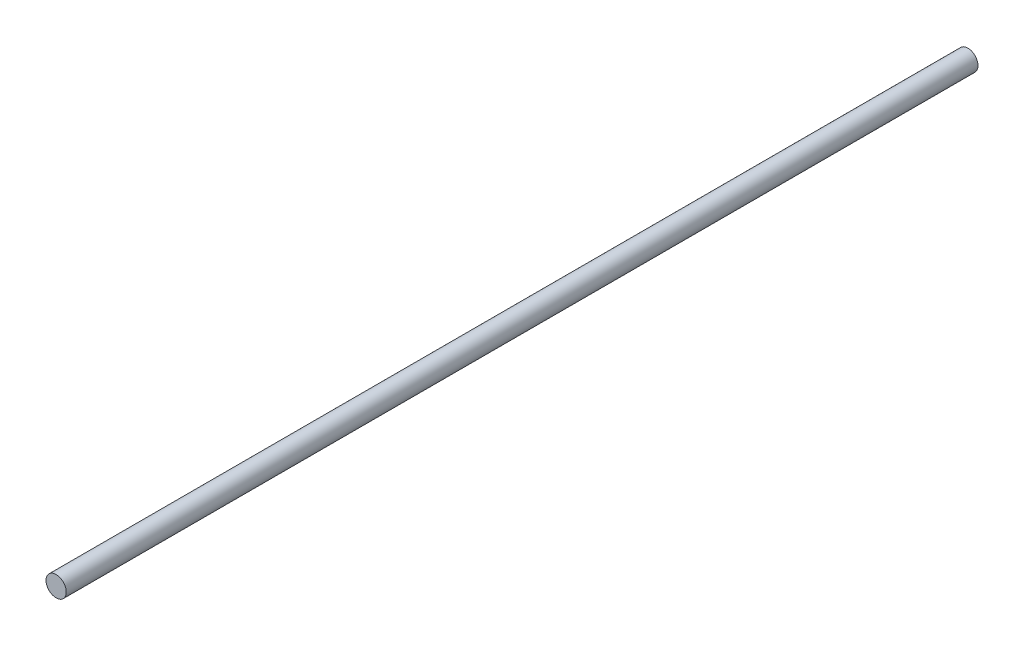
ISO-10303-21;
HEADER;
FILE_DESCRIPTION(('STEP AP214'),'2;1');
FILE_NAME('part.step','',(''),(''),'','','');
FILE_SCHEMA(('AUTOMOTIVE_DESIGN { 1 0 10303 214 1 1 1 1 }'));
ENDSEC;
DATA;
#1=APPLICATION_CONTEXT('core data for automotive mechanical design processes');
#2=APPLICATION_PROTOCOL_DEFINITION('international standard','automotive_design',2000,#1);
#3=PRODUCT_CONTEXT('',#1,'mechanical');
#4=PRODUCT('Part','Part','',(#3));
#5=PRODUCT_RELATED_PRODUCT_CATEGORY('part','',(#4));
#6=PRODUCT_DEFINITION_FORMATION('','',#4);
#7=PRODUCT_DEFINITION_CONTEXT('part definition',#1,'design');
#8=PRODUCT_DEFINITION('design','',#6,#7);
#9=PRODUCT_DEFINITION_SHAPE('','',#8);
#10=(LENGTH_UNIT() NAMED_UNIT(*) SI_UNIT(.MILLI.,.METRE.));
#11=(NAMED_UNIT(*) PLANE_ANGLE_UNIT() SI_UNIT($,.RADIAN.));
#12=(NAMED_UNIT(*) SI_UNIT($,.STERADIAN.) SOLID_ANGLE_UNIT());
#13=UNCERTAINTY_MEASURE_WITH_UNIT(LENGTH_MEASURE(1.E-05),#10,'distance_accuracy_value','');
#14=(GEOMETRIC_REPRESENTATION_CONTEXT(3) GLOBAL_UNCERTAINTY_ASSIGNED_CONTEXT((#13)) GLOBAL_UNIT_ASSIGNED_CONTEXT((#10,
#11,#12)) REPRESENTATION_CONTEXT('',''));
#15=CARTESIAN_POINT('',(0.,0.,0.));
#16=DIRECTION('',(0.,0.,1.));
#17=DIRECTION('',(1.,0.,0.));
#18=AXIS2_PLACEMENT_3D('',#15,#16,#17);
#19=CARTESIAN_POINT('',(0.,0.,360.));
#20=DIRECTION('',(0.,0.,-1.));
#21=DIRECTION('',(-1.,0.,0.));
#22=AXIS2_PLACEMENT_3D('',#19,#20,#21);
#23=CYLINDRICAL_SURFACE('',#22,4.);
#24=CARTESIAN_POINT('',(0.,0.,360.));
#25=DIRECTION('',(0.,0.,1.));
#26=DIRECTION('',(1.,0.,0.));
#27=AXIS2_PLACEMENT_3D('',#24,#25,#26);
#28=CIRCLE('',#27,4.);
#29=CARTESIAN_POINT('',(-4.,0.,360.));
#30=VERTEX_POINT('',#29);
#31=EDGE_CURVE('E10',#30,#30,#28,.T.);
#32=CARTESIAN_POINT('',(0.,0.,0.));
#33=DIRECTION('',(0.,0.,1.));
#34=DIRECTION('',(1.,0.,0.));
#35=AXIS2_PLACEMENT_3D('',#32,#33,#34);
#36=CIRCLE('',#35,4.);
#37=CARTESIAN_POINT('',(-4.,0.,0.));
#38=VERTEX_POINT('',#37);
#39=EDGE_CURVE('E33',#38,#38,#36,.T.);
#40=CARTESIAN_POINT('',(-4.,0.,360.));
#41=CARTESIAN_POINT('',(-4.,0.,356.25));
#42=CARTESIAN_POINT('',(-4.,0.,352.5));
#43=CARTESIAN_POINT('',(-4.,0.,345.));
#44=CARTESIAN_POINT('',(-4.,0.,341.25));
#45=CARTESIAN_POINT('',(-4.,0.,333.75));
#46=CARTESIAN_POINT('',(-4.,0.,330.));
#47=CARTESIAN_POINT('',(-4.,0.,322.5));
#48=CARTESIAN_POINT('',(-4.,0.,318.75));
#49=CARTESIAN_POINT('',(-4.,0.,311.25));
#50=CARTESIAN_POINT('',(-4.,0.,307.5));
#51=CARTESIAN_POINT('',(-4.,0.,300.));
#52=CARTESIAN_POINT('',(-4.,0.,296.25));
#53=CARTESIAN_POINT('',(-4.,0.,288.75));
#54=CARTESIAN_POINT('',(-4.,0.,285.));
#55=CARTESIAN_POINT('',(-4.,0.,277.5));
#56=CARTESIAN_POINT('',(-4.,0.,273.75));
#57=CARTESIAN_POINT('',(-4.,0.,266.25));
#58=CARTESIAN_POINT('',(-4.,0.,262.5));
#59=CARTESIAN_POINT('',(-4.,0.,255.));
#60=CARTESIAN_POINT('',(-4.,0.,251.25));
#61=CARTESIAN_POINT('',(-4.,0.,243.75));
#62=CARTESIAN_POINT('',(-4.,0.,240.));
#63=CARTESIAN_POINT('',(-4.,0.,232.5));
#64=CARTESIAN_POINT('',(-4.,0.,228.75));
#65=CARTESIAN_POINT('',(-4.,0.,221.25));
#66=CARTESIAN_POINT('',(-4.,0.,217.5));
#67=CARTESIAN_POINT('',(-4.,0.,210.));
#68=CARTESIAN_POINT('',(-4.,0.,206.25));
#69=CARTESIAN_POINT('',(-4.,0.,198.75));
#70=CARTESIAN_POINT('',(-4.,0.,195.));
#71=CARTESIAN_POINT('',(-4.,0.,187.5));
#72=CARTESIAN_POINT('',(-4.,0.,183.75));
#73=CARTESIAN_POINT('',(-4.,0.,176.25));
#74=CARTESIAN_POINT('',(-4.,0.,172.5));
#75=CARTESIAN_POINT('',(-4.,0.,165.));
#76=CARTESIAN_POINT('',(-4.,0.,161.25));
#77=CARTESIAN_POINT('',(-4.,0.,153.75));
#78=CARTESIAN_POINT('',(-4.,0.,150.));
#79=CARTESIAN_POINT('',(-4.,0.,142.5));
#80=CARTESIAN_POINT('',(-4.,0.,138.75));
#81=CARTESIAN_POINT('',(-4.,0.,131.25));
#82=CARTESIAN_POINT('',(-4.,0.,127.5));
#83=CARTESIAN_POINT('',(-4.,0.,120.));
#84=CARTESIAN_POINT('',(-4.,0.,116.25));
#85=CARTESIAN_POINT('',(-4.,0.,108.75));
#86=CARTESIAN_POINT('',(-4.,0.,105.));
#87=CARTESIAN_POINT('',(-4.,0.,97.5));
#88=CARTESIAN_POINT('',(-4.,0.,93.75));
#89=CARTESIAN_POINT('',(-4.,0.,86.25));
#90=CARTESIAN_POINT('',(-4.,0.,82.5));
#91=CARTESIAN_POINT('',(-4.,0.,75.));
#92=CARTESIAN_POINT('',(-4.,0.,71.25));
#93=CARTESIAN_POINT('',(-4.,0.,63.75));
#94=CARTESIAN_POINT('',(-4.,0.,60.));
#95=CARTESIAN_POINT('',(-4.,0.,52.5));
#96=CARTESIAN_POINT('',(-4.,0.,48.75));
#97=CARTESIAN_POINT('',(-4.,0.,41.25));
#98=CARTESIAN_POINT('',(-4.,0.,37.5));
#99=CARTESIAN_POINT('',(-4.,0.,30.));
#100=CARTESIAN_POINT('',(-4.,0.,26.25));
#101=CARTESIAN_POINT('',(-4.,0.,18.75));
#102=CARTESIAN_POINT('',(-4.,0.,14.9999999999999));
#103=CARTESIAN_POINT('',(-4.,0.,7.49999999999993));
#104=CARTESIAN_POINT('',(-4.,0.,3.74999999999994));
#105=CARTESIAN_POINT('',(-4.,0.,0.));
#106=B_SPLINE_CURVE_WITH_KNOTS('',3,(#40,#41,#42,#43,#44,#45,#46,#47,#48,#49,#50,#51,#52,#53,
#54,#55,#56,#57,#58,#59,#60,#61,#62,#63,#64,#65,#66,#67,#68,#69,#70,#71,#72,#73,#74,#75,#76,#77,
#78,#79,#80,#81,#82,#83,#84,#85,#86,#87,#88,#89,#90,#91,#92,#93,#94,#95,#96,#97,#98,#99,#100,
#101,#102,#103,#104,#105),.UNSPECIFIED.,.F.,.F.,(4,2,2,2,2,2,2,2,2,2,2,2,2,2,2,2,2,2,2,2,2,2,2,
2,2,2,2,2,2,2,2,2,4),(0.,11.25,22.5,33.7500000000001,45.,56.25,67.5,78.75,90.,101.25,112.5,
123.75,135.,146.25,157.5,168.75,180.,191.25,202.5,213.75,225.,236.25,247.5,258.75,270.,281.25,
292.5,303.75,315.,326.25,337.5,348.75,360.),.UNSPECIFIED.);
#107=EDGE_CURVE('BSEAM30',#30,#38,#106,.T.);
#108=ORIENTED_EDGE('',*,*,#31,.F.);
#109=ORIENTED_EDGE('',*,*,#39,.T.);
#110=ORIENTED_EDGE('',*,*,#107,.T.);
#111=ORIENTED_EDGE('',*,*,#107,.F.);
#112=EDGE_LOOP('',(#108,#110,#109,#111));
#113=FACE_BOUND('',#112,.T.);
#114=ADVANCED_FACE('F30',(#113),#23,.T.);
#115=CARTESIAN_POINT('',(0.,0.,360.));
#116=DIRECTION('',(0.,0.,1.));
#117=DIRECTION('',(1.,0.,0.));
#118=AXIS2_PLACEMENT_3D('',#115,#116,#117);
#119=PLANE('',#118);
#120=ORIENTED_EDGE('',*,*,#31,.T.);
#121=EDGE_LOOP('',(#120));
#122=FACE_BOUND('',#121,.T.);
#123=ADVANCED_FACE('F45',(#122),#119,.T.);
#124=CARTESIAN_POINT('',(0.,0.,0.));
#125=DIRECTION('',(0.,0.,1.));
#126=DIRECTION('',(1.,0.,0.));
#127=AXIS2_PLACEMENT_3D('',#124,#125,#126);
#128=PLANE('',#127);
#129=ORIENTED_EDGE('',*,*,#39,.F.);
#130=EDGE_LOOP('',(#129));
#131=FACE_BOUND('',#130,.T.);
#132=ADVANCED_FACE('F43',(#131),#128,.F.);
#133=CLOSED_SHELL('',(#114,#123,#132));
#134=MANIFOLD_SOLID_BREP('B2',#133);
#135=ADVANCED_BREP_SHAPE_REPRESENTATION('',(#18,#134),#14);
#136=SHAPE_DEFINITION_REPRESENTATION(#9,#135);
ENDSEC;
END-ISO-10303-21;
